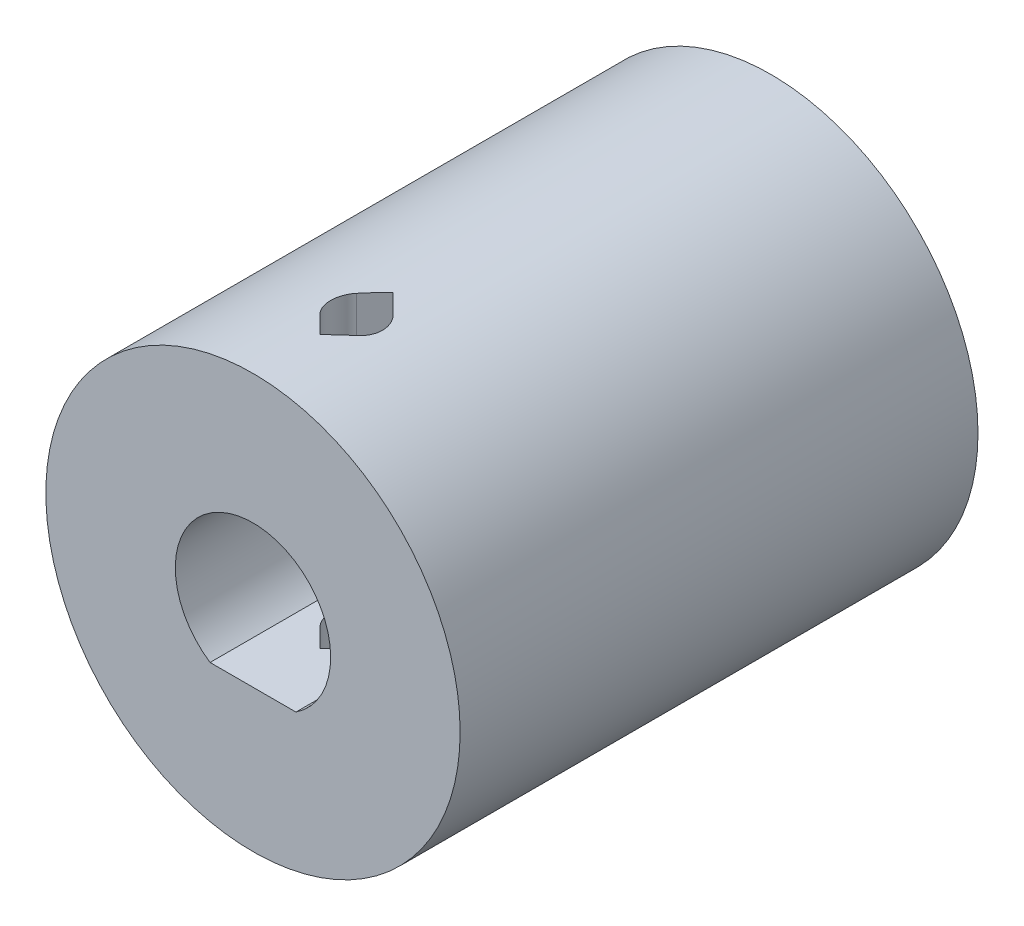
ISO-10303-21;
HEADER;
FILE_DESCRIPTION(('STEP AP214'),'2;1');
FILE_NAME('part.step','',(''),(''),'','','');
FILE_SCHEMA(('AUTOMOTIVE_DESIGN { 1 0 10303 214 1 1 1 1 }'));
ENDSEC;
DATA;
#1=APPLICATION_CONTEXT('core data for automotive mechanical design processes');
#2=APPLICATION_PROTOCOL_DEFINITION('international standard','automotive_design',2000,#1);
#3=PRODUCT_CONTEXT('',#1,'mechanical');
#4=PRODUCT('Part','Part','',(#3));
#5=PRODUCT_RELATED_PRODUCT_CATEGORY('part','',(#4));
#6=PRODUCT_DEFINITION_FORMATION('','',#4);
#7=PRODUCT_DEFINITION_CONTEXT('part definition',#1,'design');
#8=PRODUCT_DEFINITION('design','',#6,#7);
#9=PRODUCT_DEFINITION_SHAPE('','',#8);
#10=(LENGTH_UNIT() NAMED_UNIT(*) SI_UNIT(.MILLI.,.METRE.));
#11=(NAMED_UNIT(*) PLANE_ANGLE_UNIT() SI_UNIT($,.RADIAN.));
#12=(NAMED_UNIT(*) SI_UNIT($,.STERADIAN.) SOLID_ANGLE_UNIT());
#13=UNCERTAINTY_MEASURE_WITH_UNIT(LENGTH_MEASURE(1.E-05),#10,'distance_accuracy_value','');
#14=(GEOMETRIC_REPRESENTATION_CONTEXT(3) GLOBAL_UNCERTAINTY_ASSIGNED_CONTEXT((#13)) GLOBAL_UNIT_ASSIGNED_CONTEXT((#10,
#11,#12)) REPRESENTATION_CONTEXT('',''));
#15=CARTESIAN_POINT('',(0.,0.,0.));
#16=DIRECTION('',(0.,0.,1.));
#17=DIRECTION('',(1.,0.,0.));
#18=AXIS2_PLACEMENT_3D('',#15,#16,#17);
#19=CARTESIAN_POINT('',(0.,0.,12.));
#20=DIRECTION('',(0.,0.,-1.));
#21=DIRECTION('',(-1.,0.,0.));
#22=AXIS2_PLACEMENT_3D('',#19,#20,#21);
#23=CYLINDRICAL_SURFACE('',#22,3.);
#24=CARTESIAN_POINT('',(1.6583123951777,-2.5,4.));
#25=CARTESIAN_POINT('',(3.44675530662855,-1.31368118074935,4.));
#26=CARTESIAN_POINT('',(3.59463112171538,0.827349676510645,4.));
#27=CARTESIAN_POINT('',(1.98626444835849,2.24827790568407,4.));
#28=(BOUNDED_CURVE() B_SPLINE_CURVE(3,(#24,#25,#26,#27),.UNSPECIFIED.,.F.,
.F.) B_SPLINE_CURVE_WITH_KNOTS((4,4),(0.,1.),
.UNSPECIFIED.) CURVE() GEOMETRIC_REPRESENTATION_ITEM() RATIONAL_B_SPLINE_CURVE((1.,
0.739251046535707,0.739251046535707,1.)) REPRESENTATION_ITEM(''));
#29=CARTESIAN_POINT('',(1.6583123951777,-2.5,4.));
#30=VERTEX_POINT('',#29);
#31=CARTESIAN_POINT('',(1.98630617220221,2.24832536541855,4.));
#32=VERTEX_POINT('',#31);
#33=EDGE_CURVE('E408',#30,#32,#28,.T.);
#34=ORIENTED_EDGE('',*,*,#33,.F.);
#35=DIRECTION('',(0.,0.,-1.));
#36=VECTOR('',#35,1.);
#37=CARTESIAN_POINT('',(1.6583123951777,-2.5,12.));
#38=LINE('',#37,#36);
#39=CARTESIAN_POINT('',(1.6583123951777,-2.5,12.));
#40=VERTEX_POINT('',#39);
#41=EDGE_CURVE('E208',#40,#30,#38,.T.);
#42=ORIENTED_EDGE('',*,*,#41,.F.);
#43=CARTESIAN_POINT('',(0.,0.,12.));
#44=DIRECTION('',(0.,0.,1.));
#45=DIRECTION('',(1.,0.,0.));
#46=AXIS2_PLACEMENT_3D('',#43,#44,#45);
#47=CIRCLE('',#46,3.);
#48=CARTESIAN_POINT('',(-1.6583123951777,-2.5,12.));
#49=VERTEX_POINT('',#48);
#50=EDGE_CURVE('E488',#40,#49,#47,.T.);
#51=ORIENTED_EDGE('',*,*,#50,.T.);
#52=DIRECTION('',(0.,0.,-1.));
#53=VECTOR('',#52,1.);
#54=CARTESIAN_POINT('',(-1.6583123951777,-2.5,12.));
#55=LINE('',#54,#53);
#56=CARTESIAN_POINT('',(-1.6583123951777,-2.5,4.));
#57=VERTEX_POINT('',#56);
#58=EDGE_CURVE('E499',#49,#57,#55,.T.);
#59=ORIENTED_EDGE('',*,*,#58,.T.);
#60=CARTESIAN_POINT('',(0.,0.,4.));
#61=DIRECTION('',(0.,0.,1.));
#62=DIRECTION('',(1.,0.,0.));
#63=AXIS2_PLACEMENT_3D('',#60,#61,#62);
#64=CIRCLE('',#63,3.);
#65=CARTESIAN_POINT('',(-1.92299033897928,2.30270007034711,4.));
#66=VERTEX_POINT('',#65);
#67=EDGE_CURVE('E322',#66,#57,#64,.T.);
#68=ORIENTED_EDGE('',*,*,#67,.F.);
#69=EDGE_CURVE('E331',#32,#66,#64,.T.);
#70=ORIENTED_EDGE('',*,*,#69,.F.);
#71=EDGE_LOOP('',(#34,#42,#51,#59,#68,#70));
#72=FACE_BOUND('',#71,.T.);
#73=CARTESIAN_POINT('',(0.,0.,6.58578643762689));
#74=DIRECTION('',(-0.707106781186553,0.,0.707106781186542));
#75=DIRECTION('',(-0.707106781186542,0.,-0.707106781186553));
#76=AXIS2_PLACEMENT_3D('',#73,#74,#75);
#77=ELLIPSE('',#76,4.24264068711932,3.);
#78=CARTESIAN_POINT('',(0.707106781186554,2.91547594742265,7.29289321881346));
#79=VERTEX_POINT('',#78);
#80=CARTESIAN_POINT('',(0.,3.,6.58578643762689));
#81=VERTEX_POINT('',#80);
#82=EDGE_CURVE('E311',#79,#81,#77,.T.);
#83=ORIENTED_EDGE('',*,*,#82,.T.);
#84=CARTESIAN_POINT('',(0.,0.,6.5857864376269));
#85=DIRECTION('',(0.707106781186552,0.,0.707106781186543));
#86=DIRECTION('',(0.707106781186543,0.,-0.707106781186552));
#87=AXIS2_PLACEMENT_3D('',#84,#85,#86);
#88=ELLIPSE('',#87,4.24264068711931,3.);
#89=CARTESIAN_POINT('',(-0.707106781186552,2.91547594742265,7.29289321881346));
#90=VERTEX_POINT('',#89);
#91=EDGE_CURVE('E318',#81,#90,#88,.T.);
#92=ORIENTED_EDGE('',*,*,#91,.T.);
#93=CARTESIAN_POINT('',(-0.707106781186552,2.91547594742265,8.70710678118654));
#94=CARTESIAN_POINT('',(-0.746544495251623,2.90590689088709,8.66771282500314));
#95=CARTESIAN_POINT('',(-0.782650984488588,2.89630419139957,8.62497250703815));
#96=CARTESIAN_POINT('',(-0.84739581672067,2.87803104816888,8.53388355871564));
#97=CARTESIAN_POINT('',(-0.876021695283853,2.869362174342,8.48552575952272));
#98=CARTESIAN_POINT('',(-0.924901887136559,2.85398249976353,8.38434449860319));
#99=CARTESIAN_POINT('',(-0.945142898465573,2.84727481521217,8.33151410010419));
#100=CARTESIAN_POINT('',(-0.976453523603171,2.83669098170105,8.22298315194254));
#101=CARTESIAN_POINT('',(-0.987534040687127,2.83281146716512,8.16728609847596));
#102=CARTESIAN_POINT('',(-0.999875075659132,2.82847858521057,8.05678843526377));
#103=CARTESIAN_POINT('',(-1.00148599635301,2.82790298289868,8.00203170989229));
#104=CARTESIAN_POINT('',(-0.995759556065778,2.82992435750925,7.89303877469954));
#105=CARTESIAN_POINT('',(-0.988420881539864,2.83252180014412,7.83880264246412));
#106=CARTESIAN_POINT('',(-0.965388493758995,2.84045177633627,7.7338441284127));
#107=CARTESIAN_POINT('',(-0.949916168541015,2.84571170575801,7.68306711698607));
#108=CARTESIAN_POINT('',(-0.911263994011433,2.85832269312957,7.58480693577221));
#109=CARTESIAN_POINT('',(-0.888082869679271,2.86567409697617,7.53732431244172));
#110=CARTESIAN_POINT('',(-0.839936522019853,2.88010521973544,7.45567286200527));
#111=CARTESIAN_POINT('',(-0.81621511749034,2.88695491059857,7.42072038673531));
#112=CARTESIAN_POINT('',(-0.76465605735079,2.90103665229396,7.35418927976584));
#113=CARTESIAN_POINT('',(-0.736826301029517,2.90826795261612,7.32260436950714));
#114=CARTESIAN_POINT('',(-0.707106781186552,2.91547594742265,7.29289321881346));
#115=B_SPLINE_CURVE_WITH_KNOTS('',3,(#93,#94,#95,#96,#97,#98,#99,#100,#101,#102,#103,#104,#105,
#106,#107,#108,#109,#110,#111,#112,#113,#114),.UNSPECIFIED.,.F.,.F.,(4,2,2,2,2,2,2,2,2,2,4),(0.,
0.169509277672237,0.339299221728604,0.509357502633575,0.679213079114515,0.84274186120629,
1.00629464753866,1.16561011210774,1.32495194026529,1.45300990429925,1.58082477808484),.UNSPECIFIED.);
#116=CARTESIAN_POINT('',(-0.707106781186552,2.91547594742265,8.70710678118654));
#117=VERTEX_POINT('',#116);
#118=EDGE_CURVE('E275',#117,#90,#115,.T.);
#119=ORIENTED_EDGE('',*,*,#118,.F.);
#120=CARTESIAN_POINT('',(0.,0.,9.41421356237311));
#121=DIRECTION('',(-0.707106781186551,0.,0.707106781186544));
#122=DIRECTION('',(-0.707106781186544,0.,-0.707106781186551));
#123=AXIS2_PLACEMENT_3D('',#120,#121,#122);
#124=ELLIPSE('',#123,4.24264068711931,3.);
#125=CARTESIAN_POINT('',(0.,3.,9.41421356237311));
#126=VERTEX_POINT('',#125);
#127=EDGE_CURVE('E289',#126,#117,#124,.T.);
#128=ORIENTED_EDGE('',*,*,#127,.F.);
#129=CARTESIAN_POINT('',(0.,0.,9.41421356237311));
#130=DIRECTION('',(0.707106781186554,0.,0.707106781186541));
#131=DIRECTION('',(0.707106781186541,0.,-0.707106781186554));
#132=AXIS2_PLACEMENT_3D('',#129,#130,#131);
#133=ELLIPSE('',#132,4.24264068711932,3.);
#134=CARTESIAN_POINT('',(0.707106781186552,2.91547594742265,8.70710678118654));
#135=VERTEX_POINT('',#134);
#136=EDGE_CURVE('E216',#135,#126,#133,.T.);
#137=ORIENTED_EDGE('',*,*,#136,.F.);
#138=CARTESIAN_POINT('',(0.707106781186554,2.91547594742265,7.29289321881346));
#139=CARTESIAN_POINT('',(0.746544495251625,2.90590689088709,7.33228717499686));
#140=CARTESIAN_POINT('',(0.78265098448859,2.89630419139957,7.37502749296185));
#141=CARTESIAN_POINT('',(0.847395816720671,2.87803104816888,7.46611644128437));
#142=CARTESIAN_POINT('',(0.876021695283855,2.869362174342,7.51447424047728));
#143=CARTESIAN_POINT('',(0.924901887136561,2.85398249976353,7.61565550139681));
#144=CARTESIAN_POINT('',(0.945142898465575,2.84727481521217,7.66848589989581));
#145=CARTESIAN_POINT('',(0.976453523603172,2.83669098170105,7.77701684805747));
#146=CARTESIAN_POINT('',(0.987534040687127,2.83281146716512,7.83271390152404));
#147=CARTESIAN_POINT('',(0.999875075659132,2.82847858521057,7.94321156473623));
#148=CARTESIAN_POINT('',(1.00148599635301,2.82790298289868,7.99796829010772));
#149=CARTESIAN_POINT('',(0.995759556065778,2.82992435750925,8.10696122530047));
#150=CARTESIAN_POINT('',(0.988420881539864,2.83252180014412,8.16119735753588));
#151=CARTESIAN_POINT('',(0.965388493758994,2.84045177633627,8.26615587158731));
#152=CARTESIAN_POINT('',(0.949916168541015,2.84571170575801,8.31693288301394));
#153=CARTESIAN_POINT('',(0.911263994011432,2.85832269312957,8.41519306422779));
#154=CARTESIAN_POINT('',(0.88808286967927,2.86567409697617,8.46267568755828));
#155=CARTESIAN_POINT('',(0.839936522019851,2.88010521973544,8.54432713799473));
#156=CARTESIAN_POINT('',(0.816215117490338,2.88695491059857,8.5792796132647));
#157=CARTESIAN_POINT('',(0.76465605735079,2.90103665229396,8.64581072023416));
#158=CARTESIAN_POINT('',(0.736826301029517,2.90826795261612,8.67739563049286));
#159=CARTESIAN_POINT('',(0.707106781186553,2.91547594742265,8.70710678118654));
#160=B_SPLINE_CURVE_WITH_KNOTS('',3,(#138,#139,#140,#141,#142,#143,#144,#145,#146,#147,#148,
#149,#150,#151,#152,#153,#154,#155,#156,#157,#158,#159),.UNSPECIFIED.,.F.,.F.,(4,2,2,2,2,2,2,2,
2,2,4),(0.,0.169509277672237,0.339299221728605,0.509357502633579,0.679213079114516,
0.842741861206291,1.00629464753866,1.16561011210774,1.32495194026529,1.45300990429925,
1.58082477808484),.UNSPECIFIED.);
#161=EDGE_CURVE('E301',#79,#135,#160,.T.);
#162=ORIENTED_EDGE('',*,*,#161,.F.);
#163=EDGE_LOOP('',(#83,#92,#119,#128,#137,#162));
#164=FACE_BOUND('',#163,.T.);
#165=ADVANCED_FACE('F57',(#72,#164),#23,.F.);
#166=CARTESIAN_POINT('',(0.,-2.5,12.));
#167=DIRECTION('',(0.,-1.,0.));
#168=DIRECTION('',(0.,0.,-1.));
#169=AXIS2_PLACEMENT_3D('',#166,#167,#168);
#170=PLANE('',#169);
#171=CARTESIAN_POINT('',(1.6583123951777,-2.5,4.));
#172=DIRECTION('',(-1.,0.,0.));
#173=VECTOR('',#172,1.);
#174=LINE('',#171,#173);
#175=EDGE_CURVE('E414',#30,#57,#174,.T.);
#176=ORIENTED_EDGE('',*,*,#175,.T.);
#177=ORIENTED_EDGE('',*,*,#58,.F.);
#178=DIRECTION('',(-1.,0.,0.));
#179=VECTOR('',#178,1.);
#180=CARTESIAN_POINT('',(0.,-2.5,12.));
#181=LINE('',#180,#179);
#182=EDGE_CURVE('E492',#40,#49,#181,.T.);
#183=ORIENTED_EDGE('',*,*,#182,.F.);
#184=ORIENTED_EDGE('',*,*,#41,.T.);
#185=EDGE_LOOP('',(#176,#177,#183,#184));
#186=FACE_BOUND('',#185,.T.);
#187=DIRECTION('',(-0.707106781186543,0.,0.707106781186552));
#188=VECTOR('',#187,1.);
#189=CARTESIAN_POINT('',(-2.70710678118655,-2.5,9.29289321881348));
#190=LINE('',#189,#188);
#191=CARTESIAN_POINT('',(0.,-2.5,6.58578643762689));
#192=VERTEX_POINT('',#191);
#193=CARTESIAN_POINT('',(-0.707106781186552,-2.5,7.29289321881346));
#194=VERTEX_POINT('',#193);
#195=EDGE_CURVE('E315',#192,#194,#190,.T.);
#196=ORIENTED_EDGE('',*,*,#195,.F.);
#197=DIRECTION('',(-0.707106781186542,0.,-0.707106781186553));
#198=VECTOR('',#197,1.);
#199=CARTESIAN_POINT('',(2.70710678118655,-2.5,9.29289321881349));
#200=LINE('',#199,#198);
#201=CARTESIAN_POINT('',(0.707106781186554,-2.5,7.29289321881346));
#202=VERTEX_POINT('',#201);
#203=EDGE_CURVE('E308',#202,#192,#200,.T.);
#204=ORIENTED_EDGE('',*,*,#203,.F.);
#205=CARTESIAN_POINT('',(0.,-2.5,8.));
#206=DIRECTION('',(0.,-1.,0.));
#207=DIRECTION('',(0.,0.,-1.));
#208=AXIS2_PLACEMENT_3D('',#205,#206,#207);
#209=CIRCLE('',#208,1.);
#210=CARTESIAN_POINT('',(0.707106781186552,-2.5,8.70710678118654));
#211=VERTEX_POINT('',#210);
#212=EDGE_CURVE('E298',#202,#211,#209,.T.);
#213=ORIENTED_EDGE('',*,*,#212,.T.);
#214=DIRECTION('',(-0.707106781186541,0.,0.707106781186554));
#215=VECTOR('',#214,1.);
#216=CARTESIAN_POINT('',(-1.29289321881345,-2.5,10.7071067811866));
#217=LINE('',#216,#215);
#218=CARTESIAN_POINT('',(0.,-2.5,9.41421356237311));
#219=VERTEX_POINT('',#218);
#220=EDGE_CURVE('E292',#211,#219,#217,.T.);
#221=ORIENTED_EDGE('',*,*,#220,.T.);
#222=DIRECTION('',(-0.707106781186544,0.,-0.707106781186551));
#223=VECTOR('',#222,1.);
#224=CARTESIAN_POINT('',(1.29289321881345,-2.5,10.7071067811866));
#225=LINE('',#224,#223);
#226=CARTESIAN_POINT('',(-0.707106781186552,-2.5,8.70710678118654));
#227=VERTEX_POINT('',#226);
#228=EDGE_CURVE('E283',#219,#227,#225,.T.);
#229=ORIENTED_EDGE('',*,*,#228,.T.);
#230=CARTESIAN_POINT('',(0.,-2.5,8.));
#231=DIRECTION('',(0.,-1.,0.));
#232=DIRECTION('',(0.,0.,-1.));
#233=AXIS2_PLACEMENT_3D('',#230,#231,#232);
#234=CIRCLE('',#233,1.);
#235=EDGE_CURVE('E284',#227,#194,#234,.T.);
#236=ORIENTED_EDGE('',*,*,#235,.T.);
#237=EDGE_LOOP('',(#196,#204,#213,#221,#229,#236));
#238=FACE_BOUND('',#237,.T.);
#239=ADVANCED_FACE('F612',(#186,#238),#170,.F.);
#240=CARTESIAN_POINT('',(0.,0.,12.));
#241=DIRECTION('',(0.,0.,-1.));
#242=DIRECTION('',(-1.,0.,0.));
#243=AXIS2_PLACEMENT_3D('',#240,#241,#242);
#244=CYLINDRICAL_SURFACE('',#243,8.);
#245=CARTESIAN_POINT('',(0.707106781186554,7.96868872525461,7.29289321881346));
#246=CARTESIAN_POINT('',(0.746862145229429,7.96515709103125,7.33258404753605));
#247=CARTESIAN_POINT('',(0.78320103730727,7.9616357489408,7.37567837300214));
#248=CARTESIAN_POINT('',(0.84816897546063,7.95497921352591,7.4673290143472));
#249=CARTESIAN_POINT('',(0.876801693794671,7.95184383666357,7.51588271295064));
#250=CARTESIAN_POINT('',(0.925535379750706,7.94631898401423,7.61717952544982));
#251=CARTESIAN_POINT('',(0.945630942848141,7.94392998097845,7.66992526815468));
#252=CARTESIAN_POINT('',(0.976680323267441,7.94017274452224,7.77806078491189));
#253=CARTESIAN_POINT('',(0.987636897127691,7.93880420331926,7.83344975637014));
#254=CARTESIAN_POINT('',(1.00005576818294,7.93724939522374,7.94501482202784));
#255=CARTESIAN_POINT('',(1.00156575259578,7.93705719018941,8.00118552575233));
#256=CARTESIAN_POINT('',(0.995172490311846,7.93786127855559,8.11299148245489));
#257=CARTESIAN_POINT('',(0.987267506616719,7.9388577912666,8.16862663471809));
#258=CARTESIAN_POINT('',(0.962320739006834,7.94192007649058,8.27758597681951));
#259=CARTESIAN_POINT('',(0.945307923520545,7.94398245817764,8.33091691741764));
#260=CARTESIAN_POINT('',(0.902655612468504,7.94894146479201,8.43395612614799));
#261=CARTESIAN_POINT('',(0.877020238355116,7.95183769105917,8.48366611125788));
#262=CARTESIAN_POINT('',(0.827459316259774,7.95711714874891,8.56279049727067));
#263=CARTESIAN_POINT('',(0.805661832925506,7.95936338433339,8.59356953878151));
#264=CARTESIAN_POINT('',(0.758781513515916,7.96396908930962,8.65243086781842));
#265=CARTESIAN_POINT('',(0.733703565151139,7.96632838699519,8.68051706173002));
#266=CARTESIAN_POINT('',(0.707106781186552,7.96868872525461,8.70710678118654));
#267=B_SPLINE_CURVE_WITH_KNOTS('',3,(#245,#246,#247,#248,#249,#250,#251,#252,#253,#254,#255,
#256,#257,#258,#259,#260,#261,#262,#263,#264,#265,#266),.UNSPECIFIED.,.F.,.F.,(4,2,2,2,2,2,2,2,
2,2,4),(0.,0.168648066890811,0.337215624269314,0.505889736441538,0.674512954038989,
0.842284255270953,1.01008651397606,1.17735820330587,1.34455005265491,1.45767339368495,
1.57063006717695),.UNSPECIFIED.);
#268=CARTESIAN_POINT('',(0.707106781186554,7.96868872525461,7.29289321881346));
#269=VERTEX_POINT('',#268);
#270=CARTESIAN_POINT('',(0.707106781186552,7.96868872525461,8.70710678118654));
#271=VERTEX_POINT('',#270);
#272=EDGE_CURVE('E225',#269,#271,#267,.T.);
#273=ORIENTED_EDGE('',*,*,#272,.T.);
#274=CARTESIAN_POINT('',(0.,0.,9.41421356237311));
#275=DIRECTION('',(0.707106781186554,0.,0.707106781186541));
#276=DIRECTION('',(0.707106781186541,0.,-0.707106781186554));
#277=AXIS2_PLACEMENT_3D('',#274,#275,#276);
#278=ELLIPSE('',#277,11.3137084989849,8.);
#279=CARTESIAN_POINT('',(0.,8.,9.41421356237311));
#280=VERTEX_POINT('',#279);
#281=EDGE_CURVE('E75',#271,#280,#278,.T.);
#282=ORIENTED_EDGE('',*,*,#281,.T.);
#283=CARTESIAN_POINT('',(0.,0.,9.41421356237311));
#284=DIRECTION('',(-0.707106781186551,0.,0.707106781186544));
#285=DIRECTION('',(-0.707106781186544,0.,-0.707106781186551));
#286=AXIS2_PLACEMENT_3D('',#283,#284,#285);
#287=ELLIPSE('',#286,11.3137084989848,8.);
#288=CARTESIAN_POINT('',(-0.707106781186552,7.96868872525461,8.70710678118654));
#289=VERTEX_POINT('',#288);
#290=EDGE_CURVE('E198',#280,#289,#287,.T.);
#291=ORIENTED_EDGE('',*,*,#290,.T.);
#292=CARTESIAN_POINT('',(-0.707106781186552,7.96868872525461,8.70710678118654));
#293=CARTESIAN_POINT('',(-0.746862145229427,7.96515709103125,8.66741595246395));
#294=CARTESIAN_POINT('',(-0.783201037307267,7.9616357489408,8.62432162699787));
#295=CARTESIAN_POINT('',(-0.848168975460628,7.95497921352591,8.5326709856528));
#296=CARTESIAN_POINT('',(-0.87680169379467,7.95184383666357,8.48411728704937));
#297=CARTESIAN_POINT('',(-0.925535379750705,7.94631898401423,8.38282047455019));
#298=CARTESIAN_POINT('',(-0.945630942848141,7.94392998097845,8.33007473184532));
#299=CARTESIAN_POINT('',(-0.976680323267441,7.94017274452224,8.22193921508811));
#300=CARTESIAN_POINT('',(-0.987636897127691,7.93880420331926,8.16655024362986));
#301=CARTESIAN_POINT('',(-1.00005576818294,7.93724939522374,8.05498517797216));
#302=CARTESIAN_POINT('',(-1.00156575259578,7.93705719018941,7.99881447424768));
#303=CARTESIAN_POINT('',(-0.995172490311846,7.93786127855559,7.88700851754511));
#304=CARTESIAN_POINT('',(-0.987267506616719,7.9388577912666,7.83137336528192));
#305=CARTESIAN_POINT('',(-0.962320739006834,7.94192007649058,7.72241402318049));
#306=CARTESIAN_POINT('',(-0.945307923520546,7.94398245817764,7.66908308258236));
#307=CARTESIAN_POINT('',(-0.902655612468505,7.94894146479201,7.56604387385201));
#308=CARTESIAN_POINT('',(-0.877020238355117,7.95183769105917,7.51633388874213));
#309=CARTESIAN_POINT('',(-0.827459316259776,7.95711714874891,7.43720950272933));
#310=CARTESIAN_POINT('',(-0.805661832925507,7.95936338433339,7.4064304612185));
#311=CARTESIAN_POINT('',(-0.758781513515917,7.96396908930962,7.34756913218158));
#312=CARTESIAN_POINT('',(-0.733703565151139,7.96632838699519,7.31948293826998));
#313=CARTESIAN_POINT('',(-0.707106781186552,7.96868872525461,7.29289321881346));
#314=B_SPLINE_CURVE_WITH_KNOTS('',3,(#292,#293,#294,#295,#296,#297,#298,#299,#300,#301,#302,
#303,#304,#305,#306,#307,#308,#309,#310,#311,#312,#313),.UNSPECIFIED.,.F.,.F.,(4,2,2,2,2,2,2,2,
2,2,4),(0.,0.16864806689081,0.337215624269314,0.505889736441541,0.67451295403899,
0.842284255270954,1.01008651397606,1.17735820330587,1.34455005265491,1.45767339368495,
1.57063006717696),.UNSPECIFIED.);
#315=CARTESIAN_POINT('',(-0.707106781186552,7.96868872525461,7.29289321881346));
#316=VERTEX_POINT('',#315);
#317=EDGE_CURVE('E260',#289,#316,#314,.T.);
#318=ORIENTED_EDGE('',*,*,#317,.T.);
#319=CARTESIAN_POINT('',(0.,0.,6.5857864376269));
#320=DIRECTION('',(0.707106781186552,0.,0.707106781186543));
#321=DIRECTION('',(0.707106781186543,0.,-0.707106781186552));
#322=AXIS2_PLACEMENT_3D('',#319,#320,#321);
#323=ELLIPSE('',#322,11.3137084989848,8.);
#324=CARTESIAN_POINT('',(0.,8.,6.58578643762689));
#325=VERTEX_POINT('',#324);
#326=EDGE_CURVE('E227',#325,#316,#323,.T.);
#327=ORIENTED_EDGE('',*,*,#326,.F.);
#328=CARTESIAN_POINT('',(0.,0.,6.58578643762689));
#329=DIRECTION('',(-0.707106781186553,0.,0.707106781186542));
#330=DIRECTION('',(-0.707106781186542,0.,-0.707106781186553));
#331=AXIS2_PLACEMENT_3D('',#328,#329,#330);
#332=ELLIPSE('',#331,11.3137084989849,8.);
#333=EDGE_CURVE('E207',#269,#325,#332,.T.);
#334=ORIENTED_EDGE('',*,*,#333,.F.);
#335=EDGE_LOOP('',(#273,#282,#291,#318,#327,#334));
#336=FACE_BOUND('',#335,.T.);
#337=CARTESIAN_POINT('',(0.,0.,12.));
#338=DIRECTION('',(0.,0.,1.));
#339=DIRECTION('',(1.,0.,0.));
#340=AXIS2_PLACEMENT_3D('',#337,#338,#339);
#341=CIRCLE('',#340,8.);
#342=CARTESIAN_POINT('',(8.,0.,12.));
#343=VERTEX_POINT('',#342);
#344=EDGE_CURVE('E495',#343,#343,#341,.T.);
#345=ORIENTED_EDGE('',*,*,#344,.F.);
#346=EDGE_LOOP('',(#345));
#347=FACE_BOUND('',#346,.T.);
#348=CARTESIAN_POINT('',(0.,0.,-8.));
#349=DIRECTION('',(0.,0.,1.));
#350=DIRECTION('',(1.,0.,0.));
#351=AXIS2_PLACEMENT_3D('',#348,#349,#350);
#352=CIRCLE('',#351,8.);
#353=CARTESIAN_POINT('',(8.,0.,-8.));
#354=VERTEX_POINT('',#353);
#355=EDGE_CURVE('E404',#354,#354,#352,.T.);
#356=ORIENTED_EDGE('',*,*,#355,.T.);
#357=EDGE_LOOP('',(#356));
#358=FACE_BOUND('',#357,.T.);
#359=CARTESIAN_POINT('',(-0.707106781186552,-7.96868872525461,8.70710678118654));
#360=VERTEX_POINT('',#359);
#361=CARTESIAN_POINT('',(0.,-8.,9.41421356237311));
#362=VERTEX_POINT('',#361);
#363=EDGE_CURVE('E210',#360,#362,#287,.T.);
#364=ORIENTED_EDGE('',*,*,#363,.T.);
#365=CARTESIAN_POINT('',(0.707106781186552,-7.96868872525461,8.70710678118654));
#366=VERTEX_POINT('',#365);
#367=EDGE_CURVE('E12',#362,#366,#278,.T.);
#368=ORIENTED_EDGE('',*,*,#367,.T.);
#369=CARTESIAN_POINT('',(0.707106781186553,-7.96868872525461,8.70710678118654));
#370=CARTESIAN_POINT('',(0.746862145229428,-7.96515709103125,8.66741595246395));
#371=CARTESIAN_POINT('',(0.783201037307269,-7.9616357489408,8.62432162699786));
#372=CARTESIAN_POINT('',(0.84816897546063,-7.95497921352591,8.5326709856528));
#373=CARTESIAN_POINT('',(0.876801693794671,-7.95184383666357,8.48411728704936));
#374=CARTESIAN_POINT('',(0.925535379750705,-7.94631898401423,8.38282047455018));
#375=CARTESIAN_POINT('',(0.94563094284814,-7.94392998097845,8.33007473184532));
#376=CARTESIAN_POINT('',(0.97668032326744,-7.94017274452225,8.22193921508812));
#377=CARTESIAN_POINT('',(0.98763689712769,-7.93880420331926,8.16655024362986));
#378=CARTESIAN_POINT('',(1.00005576818294,-7.93724939522374,8.05498517797216));
#379=CARTESIAN_POINT('',(1.00156575259578,-7.93705719018941,7.99881447424767));
#380=CARTESIAN_POINT('',(0.995172490311846,-7.93786127855559,7.88700851754511));
#381=CARTESIAN_POINT('',(0.987267506616719,-7.9388577912666,7.83137336528191));
#382=CARTESIAN_POINT('',(0.962320739006834,-7.94192007649058,7.72241402318049));
#383=CARTESIAN_POINT('',(0.945307923520546,-7.94398245817764,7.66908308258236));
#384=CARTESIAN_POINT('',(0.902655612468505,-7.94894146479201,7.56604387385201));
#385=CARTESIAN_POINT('',(0.877020238355117,-7.95183769105917,7.51633388874213));
#386=CARTESIAN_POINT('',(0.827459316259775,-7.95711714874891,7.43720950272933));
#387=CARTESIAN_POINT('',(0.805661832925507,-7.95936338433339,7.4064304612185));
#388=CARTESIAN_POINT('',(0.758781513515917,-7.96396908930962,7.34756913218158));
#389=CARTESIAN_POINT('',(0.73370356515114,-7.96632838699519,7.31948293826999));
#390=CARTESIAN_POINT('',(0.707106781186554,-7.96868872525461,7.29289321881346));
#391=B_SPLINE_CURVE_WITH_KNOTS('',3,(#369,#370,#371,#372,#373,#374,#375,#376,#377,#378,#379,
#380,#381,#382,#383,#384,#385,#386,#387,#388,#389,#390),.UNSPECIFIED.,.F.,.F.,(4,2,2,2,2,2,2,2,
2,2,4),(0.,0.168648066890811,0.337215624269313,0.505889736441535,0.674512954038988,
0.842284255270955,1.01008651397606,1.17735820330587,1.3445500526549,1.45767339368495,
1.57063006717695),.UNSPECIFIED.);
#392=CARTESIAN_POINT('',(0.707106781186554,-7.96868872525461,7.29289321881346));
#393=VERTEX_POINT('',#392);
#394=EDGE_CURVE('E61',#366,#393,#391,.T.);
#395=ORIENTED_EDGE('',*,*,#394,.T.);
#396=CARTESIAN_POINT('',(0.,-8.,6.58578643762689));
#397=VERTEX_POINT('',#396);
#398=EDGE_CURVE('E232',#397,#393,#332,.T.);
#399=ORIENTED_EDGE('',*,*,#398,.F.);
#400=CARTESIAN_POINT('',(-0.707106781186552,-7.96868872525461,7.29289321881346));
#401=VERTEX_POINT('',#400);
#402=EDGE_CURVE('E73',#401,#397,#323,.T.);
#403=ORIENTED_EDGE('',*,*,#402,.F.);
#404=CARTESIAN_POINT('',(-0.707106781186552,-7.96868872525461,7.29289321881346));
#405=CARTESIAN_POINT('',(-0.746862145229427,-7.96515709103125,7.33258404753605));
#406=CARTESIAN_POINT('',(-0.783201037307268,-7.9616357489408,7.37567837300213));
#407=CARTESIAN_POINT('',(-0.848168975460628,-7.95497921352591,7.4673290143472));
#408=CARTESIAN_POINT('',(-0.87680169379467,-7.95184383666357,7.51588271295064));
#409=CARTESIAN_POINT('',(-0.925535379750704,-7.94631898401423,7.61717952544981));
#410=CARTESIAN_POINT('',(-0.94563094284814,-7.94392998097845,7.66992526815468));
#411=CARTESIAN_POINT('',(-0.97668032326744,-7.94017274452225,7.77806078491188));
#412=CARTESIAN_POINT('',(-0.98763689712769,-7.93880420331926,7.83344975637014));
#413=CARTESIAN_POINT('',(-1.00005576818294,-7.93724939522374,7.94501482202784));
#414=CARTESIAN_POINT('',(-1.00156575259578,-7.93705719018941,8.00118552575232));
#415=CARTESIAN_POINT('',(-0.995172490311846,-7.93786127855559,8.11299148245489));
#416=CARTESIAN_POINT('',(-0.98726750661672,-7.9388577912666,8.16862663471808));
#417=CARTESIAN_POINT('',(-0.962320739006835,-7.94192007649058,8.27758597681951));
#418=CARTESIAN_POINT('',(-0.945307923520547,-7.94398245817764,8.33091691741764));
#419=CARTESIAN_POINT('',(-0.902655612468506,-7.94894146479201,8.43395612614799));
#420=CARTESIAN_POINT('',(-0.877020238355117,-7.95183769105917,8.48366611125787));
#421=CARTESIAN_POINT('',(-0.827459316259775,-7.95711714874891,8.56279049727067));
#422=CARTESIAN_POINT('',(-0.805661832925507,-7.95936338433339,8.59356953878151));
#423=CARTESIAN_POINT('',(-0.758781513515917,-7.96396908930962,8.65243086781842));
#424=CARTESIAN_POINT('',(-0.733703565151139,-7.96632838699519,8.68051706173002));
#425=CARTESIAN_POINT('',(-0.707106781186552,-7.96868872525461,8.70710678118654));
#426=B_SPLINE_CURVE_WITH_KNOTS('',3,(#404,#405,#406,#407,#408,#409,#410,#411,#412,#413,#414,
#415,#416,#417,#418,#419,#420,#421,#422,#423,#424,#425),.UNSPECIFIED.,.F.,.F.,(4,2,2,2,2,2,2,2,
2,2,4),(0.,0.168648066890811,0.337215624269313,0.505889736441537,0.674512954038988,
0.842284255270954,1.01008651397606,1.17735820330587,1.34455005265491,1.45767339368495,
1.57063006717695),.UNSPECIFIED.);
#427=EDGE_CURVE('E237',#401,#360,#426,.T.);
#428=ORIENTED_EDGE('',*,*,#427,.T.);
#429=EDGE_LOOP('',(#364,#368,#395,#399,#403,#428));
#430=FACE_BOUND('',#429,.T.);
#431=ADVANCED_FACE('F222',(#336,#347,#358,#430),#244,.T.);
#432=CARTESIAN_POINT('',(0.,0.,12.));
#433=DIRECTION('',(0.,0.,1.));
#434=DIRECTION('',(1.,0.,0.));
#435=AXIS2_PLACEMENT_3D('',#432,#433,#434);
#436=PLANE('',#435);
#437=ORIENTED_EDGE('',*,*,#50,.F.);
#438=ORIENTED_EDGE('',*,*,#182,.T.);
#439=EDGE_LOOP('',(#437,#438));
#440=FACE_BOUND('',#439,.T.);
#441=ORIENTED_EDGE('',*,*,#344,.T.);
#442=EDGE_LOOP('',(#441));
#443=FACE_BOUND('',#442,.T.);
#444=ADVANCED_FACE('F619',(#440,#443),#436,.T.);
#445=CARTESIAN_POINT('',(0.,0.,-8.));
#446=DIRECTION('',(0.,0.,1.));
#447=DIRECTION('',(1.,0.,0.));
#448=AXIS2_PLACEMENT_3D('',#445,#446,#447);
#449=CYLINDRICAL_SURFACE('',#448,4.125);
#450=CARTESIAN_POINT('',(2.9168154723945,2.91681547239452,0.));
#451=CARTESIAN_POINT('',(4.62544641718353,1.2081845276055,0.));
#452=CARTESIAN_POINT('',(4.62544641718353,-1.20818452760549,0.));
#453=CARTESIAN_POINT('',(2.9168154723945,-2.91681547239451,0.));
#454=(BOUNDED_CURVE() B_SPLINE_CURVE(3,(#450,#451,#452,#453),.UNSPECIFIED.,.F.,
.F.) B_SPLINE_CURVE_WITH_KNOTS((4,4),(0.,1.),
.UNSPECIFIED.) CURVE() GEOMETRIC_REPRESENTATION_ITEM() RATIONAL_B_SPLINE_CURVE((1.,
0.804737854124364,0.804737854124364,1.)) REPRESENTATION_ITEM(''));
#455=CARTESIAN_POINT('',(2.9168154723945,-2.91681547239451,0.));
#456=VERTEX_POINT('',#455);
#457=CARTESIAN_POINT('',(2.9168154723945,2.91681547239452,0.));
#458=VERTEX_POINT('',#457);
#459=EDGE_CURVE('E586',#456,#458,#454,.F.);
#460=ORIENTED_EDGE('',*,*,#459,.T.);
#461=DIRECTION('',(0.,0.,1.));
#462=VECTOR('',#461,1.);
#463=CARTESIAN_POINT('',(2.9168154723945,2.91681547239452,-8.));
#464=LINE('',#463,#462);
#465=CARTESIAN_POINT('',(2.9168154723945,2.91681547239452,-8.));
#466=VERTEX_POINT('',#465);
#467=EDGE_CURVE('E406',#466,#458,#464,.T.);
#468=ORIENTED_EDGE('',*,*,#467,.F.);
#469=CARTESIAN_POINT('',(0.,0.,-8.));
#470=DIRECTION('',(0.,0.,1.));
#471=DIRECTION('',(1.,0.,0.));
#472=AXIS2_PLACEMENT_3D('',#469,#470,#471);
#473=CIRCLE('',#472,4.125);
#474=CARTESIAN_POINT('',(2.9168154723945,-2.91681547239451,-8.));
#475=VERTEX_POINT('',#474);
#476=EDGE_CURVE('E470',#475,#466,#473,.T.);
#477=ORIENTED_EDGE('',*,*,#476,.F.);
#478=DIRECTION('',(0.,0.,1.));
#479=VECTOR('',#478,1.);
#480=CARTESIAN_POINT('',(2.9168154723945,-2.91681547239451,-8.));
#481=LINE('',#480,#479);
#482=EDGE_CURVE('E400',#475,#456,#481,.T.);
#483=ORIENTED_EDGE('',*,*,#482,.T.);
#484=EDGE_LOOP('',(#460,#468,#477,#483));
#485=FACE_BOUND('',#484,.T.);
#486=ADVANCED_FACE('F543',(#485),#449,.F.);
#487=CARTESIAN_POINT('',(0.,2.91681547239452,-8.));
#488=DIRECTION('',(0.,-1.,0.));
#489=DIRECTION('',(0.,0.,-1.));
#490=AXIS2_PLACEMENT_3D('',#487,#488,#489);
#491=PLANE('',#490);
#492=CARTESIAN_POINT('',(-2.9168154723945,2.91681547239452,0.));
#493=CARTESIAN_POINT('',(-2.43067956032875,2.91681547239452,0.));
#494=CARTESIAN_POINT('',(-1.944543648263,2.91681547239452,0.));
#495=CARTESIAN_POINT('',(-0.972271824131502,2.91681547239452,0.));
#496=CARTESIAN_POINT('',(-0.486135912065752,2.91681547239452,0.));
#497=CARTESIAN_POINT('',(0.48613591206575,2.91681547239452,0.));
#498=CARTESIAN_POINT('',(0.9722718241315,2.91681547239452,0.));
#499=CARTESIAN_POINT('',(1.944543648263,2.91681547239452,0.));
#500=CARTESIAN_POINT('',(2.43067956032875,2.91681547239452,0.));
#501=CARTESIAN_POINT('',(2.9168154723945,2.91681547239452,0.));
#502=B_SPLINE_CURVE_WITH_KNOTS('',3,(#492,#493,#494,#495,#496,#497,#498,#499,#500,#501),
.UNSPECIFIED.,.F.,.F.,(4,2,2,2,4),(0.,0.25,0.5,0.75,1.),.UNSPECIFIED.);
#503=CARTESIAN_POINT('',(-2.9168154723945,2.91681547239452,0.));
#504=VERTEX_POINT('',#503);
#505=EDGE_CURVE('E478',#504,#458,#502,.T.);
#506=ORIENTED_EDGE('',*,*,#505,.F.);
#507=DIRECTION('',(0.,0.,1.));
#508=VECTOR('',#507,1.);
#509=CARTESIAN_POINT('',(-2.9168154723945,2.91681547239452,-8.));
#510=LINE('',#509,#508);
#511=CARTESIAN_POINT('',(-2.9168154723945,2.91681547239452,-8.));
#512=VERTEX_POINT('',#511);
#513=EDGE_CURVE('E399',#512,#504,#510,.T.);
#514=ORIENTED_EDGE('',*,*,#513,.F.);
#515=DIRECTION('',(1.,0.,0.));
#516=VECTOR('',#515,1.);
#517=CARTESIAN_POINT('',(0.,2.91681547239452,-8.));
#518=LINE('',#517,#516);
#519=EDGE_CURVE('E483',#512,#466,#518,.T.);
#520=ORIENTED_EDGE('',*,*,#519,.T.);
#521=ORIENTED_EDGE('',*,*,#467,.T.);
#522=EDGE_LOOP('',(#506,#514,#520,#521));
#523=FACE_BOUND('',#522,.T.);
#524=ADVANCED_FACE('F532',(#523),#491,.T.);
#525=CARTESIAN_POINT('',(-2.9168154723945,-2.91681547239451,0.));
#526=CARTESIAN_POINT('',(-4.62544641718353,-1.20818452760549,0.));
#527=CARTESIAN_POINT('',(-4.62544641718353,1.2081845276055,0.));
#528=CARTESIAN_POINT('',(-2.9168154723945,2.91681547239452,0.));
#529=(BOUNDED_CURVE() B_SPLINE_CURVE(3,(#525,#526,#527,#528),.UNSPECIFIED.,.F.,
.F.) B_SPLINE_CURVE_WITH_KNOTS((4,4),(0.,1.),
.UNSPECIFIED.) CURVE() GEOMETRIC_REPRESENTATION_ITEM() RATIONAL_B_SPLINE_CURVE((1.,
0.804737854124364,0.804737854124364,1.)) REPRESENTATION_ITEM(''));
#530=CARTESIAN_POINT('',(-2.9168154723945,-2.91681547239451,0.));
#531=VERTEX_POINT('',#530);
#532=EDGE_CURVE('E567',#504,#531,#529,.F.);
#533=ORIENTED_EDGE('',*,*,#532,.T.);
#534=DIRECTION('',(0.,0.,1.));
#535=VECTOR('',#534,1.);
#536=CARTESIAN_POINT('',(-2.9168154723945,-2.91681547239451,-8.));
#537=LINE('',#536,#535);
#538=CARTESIAN_POINT('',(-2.9168154723945,-2.91681547239451,-8.));
#539=VERTEX_POINT('',#538);
#540=EDGE_CURVE('E396',#539,#531,#537,.T.);
#541=ORIENTED_EDGE('',*,*,#540,.F.);
#542=EDGE_CURVE('E479',#512,#539,#473,.T.);
#543=ORIENTED_EDGE('',*,*,#542,.F.);
#544=ORIENTED_EDGE('',*,*,#513,.T.);
#545=EDGE_LOOP('',(#533,#541,#543,#544));
#546=FACE_BOUND('',#545,.T.);
#547=ADVANCED_FACE('F542',(#546),#449,.F.);
#548=CARTESIAN_POINT('',(0.,-2.91681547239451,-8.));
#549=DIRECTION('',(0.,1.,0.));
#550=DIRECTION('',(0.,0.,1.));
#551=AXIS2_PLACEMENT_3D('',#548,#549,#550);
#552=PLANE('',#551);
#553=CARTESIAN_POINT('',(2.9168154723945,-2.91681547239451,0.));
#554=DIRECTION('',(-1.,0.,0.));
#555=VECTOR('',#554,1.);
#556=LINE('',#553,#555);
#557=EDGE_CURVE('E581',#456,#531,#556,.T.);
#558=ORIENTED_EDGE('',*,*,#557,.F.);
#559=ORIENTED_EDGE('',*,*,#482,.F.);
#560=DIRECTION('',(-1.,0.,0.));
#561=VECTOR('',#560,1.);
#562=CARTESIAN_POINT('',(0.,-2.91681547239451,-8.));
#563=LINE('',#562,#561);
#564=EDGE_CURVE('E477',#475,#539,#563,.T.);
#565=ORIENTED_EDGE('',*,*,#564,.T.);
#566=ORIENTED_EDGE('',*,*,#540,.T.);
#567=EDGE_LOOP('',(#558,#559,#565,#566));
#568=FACE_BOUND('',#567,.T.);
#569=ADVANCED_FACE('F548',(#568),#552,.T.);
#570=CARTESIAN_POINT('',(0.,0.,-8.));
#571=DIRECTION('',(0.,0.,1.));
#572=DIRECTION('',(1.,0.,0.));
#573=AXIS2_PLACEMENT_3D('',#570,#571,#572);
#574=PLANE('',#573);
#575=ORIENTED_EDGE('',*,*,#476,.T.);
#576=ORIENTED_EDGE('',*,*,#519,.F.);
#577=ORIENTED_EDGE('',*,*,#542,.T.);
#578=ORIENTED_EDGE('',*,*,#564,.F.);
#579=EDGE_LOOP('',(#575,#576,#577,#578));
#580=FACE_BOUND('',#579,.T.);
#581=ORIENTED_EDGE('',*,*,#355,.F.);
#582=EDGE_LOOP('',(#581));
#583=FACE_BOUND('',#582,.T.);
#584=ADVANCED_FACE('F454',(#580,#583),#574,.F.);
#585=CARTESIAN_POINT('',(-1.6583123951777,-2.5,4.));
#586=CARTESIAN_POINT('',(-2.9168154723945,-2.91681547239451,0.));
#587=CARTESIAN_POINT('',(-3.48393971366875,-1.28901583550851,4.));
#588=CARTESIAN_POINT('',(-4.62544641718353,-1.20818452760549,0.));
#589=CARTESIAN_POINT('',(-3.60447526941571,0.898418490927549,4.));
#590=CARTESIAN_POINT('',(-4.62544641718353,1.2081845276055,0.));
#591=CARTESIAN_POINT('',(-1.92295631118378,2.3026591205123,4.));
#592=CARTESIAN_POINT('',(-2.9168154723945,2.91681547239452,0.));
#593=(BOUNDED_SURFACE() B_SPLINE_SURFACE(3,1,((#585,#586),(#587,#588),(#589,#590),(#591,#592)),
.UNSPECIFIED.,.F.,.F.,.F.) B_SPLINE_SURFACE_WITH_KNOTS((4,4),(2,2),(0.,1.),(0.,1.),
.UNSPECIFIED.) GEOMETRIC_REPRESENTATION_ITEM() RATIONAL_B_SPLINE_SURFACE(((1.,1.),
(0.731855742664693,0.804737854124364),(0.731855742664693,0.804737854124364),(1.,1.))) REPRESENTATION_ITEM('') SURFACE());
#594=DIRECTION('',(0.298650037519537,0.0989127152113434,0.9492230664386));
#595=VECTOR('',#594,1.);
#596=CARTESIAN_POINT('',(-2.2875639337861,-2.70840773619726,2.));
#597=LINE('',#596,#595);
#598=EDGE_CURVE('E335',#531,#57,#597,.T.);
#599=DIRECTION('',(-0.238499872419745,0.14738125610398,-0.959894044259562));
#600=VECTOR('',#599,1.);
#601=CARTESIAN_POINT('',(-2.41988589178914,2.60973729645341,2.));
#602=LINE('',#601,#600);
#603=EDGE_CURVE('E416',#66,#504,#602,.T.);
#604=ORIENTED_EDGE('',*,*,#67,.T.);
#605=ORIENTED_EDGE('',*,*,#598,.F.);
#606=ORIENTED_EDGE('',*,*,#532,.F.);
#607=ORIENTED_EDGE('',*,*,#603,.F.);
#608=EDGE_LOOP('',(#604,#605,#606,#607));
#609=FACE_BOUND('',#608,.T.);
#610=ADVANCED_FACE('F441',(#609),#593,.F.);
#611=CARTESIAN_POINT('',(-1.92295631118378,2.3026591205123,4.));
#612=CARTESIAN_POINT('',(-2.9168154723945,2.91681547239452,0.));
#613=CARTESIAN_POINT('',(-1.67288759529236,2.5114921219624,4.));
#614=CARTESIAN_POINT('',(-2.43067956032875,2.91681547239452,0.));
#615=CARTESIAN_POINT('',(-1.37185001033666,2.69190623435599,4.));
#616=CARTESIAN_POINT('',(-1.944543648263,2.91681547239452,0.));
#617=CARTESIAN_POINT('',(-0.699427232093589,2.93924023727752,4.));
#618=CARTESIAN_POINT('',(-0.972271824131502,2.91681547239452,0.));
#619=CARTESIAN_POINT('',(-0.328764885631519,3.00486371241362,4.));
#620=CARTESIAN_POINT('',(-0.486135912065752,2.91681547239452,0.));
#621=CARTESIAN_POINT('',(0.412222879608885,2.99455582311157,4.));
#622=CARTESIAN_POINT('',(0.48613591206575,2.91681547239452,0.));
#623=CARTESIAN_POINT('',(0.780916370878354,2.91864716043573,4.));
#624=CARTESIAN_POINT('',(0.9722718241315,2.91681547239452,0.));
#625=CARTESIAN_POINT('',(1.44619894910685,2.65270432295564,4.));
#626=CARTESIAN_POINT('',(1.944543648263,2.91681547239452,0.));
#627=CARTESIAN_POINT('',(1.74210153087187,2.46398616905537,4.));
#628=CARTESIAN_POINT('',(2.43067956032875,2.91681547239452,0.));
#629=CARTESIAN_POINT('',(1.98626444835849,2.24827790568407,4.));
#630=CARTESIAN_POINT('',(2.9168154723945,2.91681547239452,0.));
#631=B_SPLINE_SURFACE_WITH_KNOTS('',3,1,((#611,#612),(#613,#614),(#615,#616),(#617,#618),(#619,
#620),(#621,#622),(#623,#624),(#625,#626),(#627,#628),(#629,#630)),.UNSPECIFIED.,.F.,.F.,.F.,(4,
2,2,2,4),(2,2),(0.,0.25,0.5,0.75,1.),(0.,1.),.UNSPECIFIED.);
#632=DIRECTION('',(0.223643194167864,0.160672411268604,-0.961336620523492));
#633=VECTOR('',#632,1.);
#634=CARTESIAN_POINT('',(2.4515399603765,2.58254668903929,2.));
#635=LINE('',#634,#633);
#636=EDGE_CURVE('E424',#32,#458,#635,.T.);
#637=ORIENTED_EDGE('',*,*,#69,.T.);
#638=ORIENTED_EDGE('',*,*,#603,.T.);
#639=ORIENTED_EDGE('',*,*,#505,.T.);
#640=ORIENTED_EDGE('',*,*,#636,.F.);
#641=EDGE_LOOP('',(#637,#638,#639,#640));
#642=FACE_BOUND('',#641,.T.);
#643=ADVANCED_FACE('F453',(#642),#631,.F.);
#644=CARTESIAN_POINT('',(0.,-2.88548360412955,0.30067855288547));
#645=DIRECTION('',(0.,0.994614595310005,-0.103642688098654));
#646=DIRECTION('',(0.,0.103642688098654,0.994614595310005));
#647=AXIS2_PLACEMENT_3D('',#644,#645,#646);
#648=PLANE('',#647);
#649=ORIENTED_EDGE('',*,*,#598,.T.);
#650=ORIENTED_EDGE('',*,*,#175,.F.);
#651=DIRECTION('',(0.298650037519537,-0.0989127152113435,-0.9492230664386));
#652=VECTOR('',#651,1.);
#653=CARTESIAN_POINT('',(2.2875639337861,-2.70840773619726,2.));
#654=LINE('',#653,#652);
#655=EDGE_CURVE('E591',#30,#456,#654,.T.);
#656=ORIENTED_EDGE('',*,*,#655,.T.);
#657=ORIENTED_EDGE('',*,*,#557,.T.);
#658=EDGE_LOOP('',(#649,#650,#656,#657));
#659=FACE_BOUND('',#658,.T.);
#660=ADVANCED_FACE('F607',(#659),#648,.T.);
#661=CARTESIAN_POINT('',(1.98626444835849,2.24827790568407,4.));
#662=CARTESIAN_POINT('',(2.9168154723945,2.91681547239452,0.));
#663=CARTESIAN_POINT('',(3.59463112171538,0.827349676510645,4.));
#664=CARTESIAN_POINT('',(4.62544641718353,1.2081845276055,0.));
#665=CARTESIAN_POINT('',(3.44675530662855,-1.31368118074935,4.));
#666=CARTESIAN_POINT('',(4.62544641718353,-1.20818452760549,0.));
#667=CARTESIAN_POINT('',(1.6583123951777,-2.5,4.));
#668=CARTESIAN_POINT('',(2.9168154723945,-2.91681547239451,0.));
#669=(BOUNDED_SURFACE() B_SPLINE_SURFACE(3,1,((#661,#662),(#663,#664),(#665,#666),(#667,#668)),
.UNSPECIFIED.,.F.,.F.,.F.) B_SPLINE_SURFACE_WITH_KNOTS((4,4),(2,2),(0.,1.),(0.,1.),
.UNSPECIFIED.) GEOMETRIC_REPRESENTATION_ITEM() RATIONAL_B_SPLINE_SURFACE(((1.,1.),
(0.739251046535707,0.804737854124364),(0.739251046535707,0.804737854124364),(1.,1.))) REPRESENTATION_ITEM('') SURFACE());
#670=ORIENTED_EDGE('',*,*,#33,.T.);
#671=ORIENTED_EDGE('',*,*,#636,.T.);
#672=ORIENTED_EDGE('',*,*,#459,.F.);
#673=ORIENTED_EDGE('',*,*,#655,.F.);
#674=EDGE_LOOP('',(#670,#671,#672,#673));
#675=FACE_BOUND('',#674,.T.);
#676=ADVANCED_FACE('F680',(#675),#669,.F.);
#677=CARTESIAN_POINT('',(0.,-8.,8.));
#678=DIRECTION('',(0.,1.,0.));
#679=DIRECTION('',(0.,0.,1.));
#680=AXIS2_PLACEMENT_3D('',#677,#678,#679);
#681=CYLINDRICAL_SURFACE('',#680,1.);
#682=DIRECTION('',(0.,1.,0.));
#683=VECTOR('',#682,1.);
#684=CARTESIAN_POINT('',(-0.707106781186552,-8.,8.70710678118654));
#685=LINE('',#684,#683);
#686=EDGE_CURVE('E219',#360,#227,#685,.T.);
#687=ORIENTED_EDGE('',*,*,#686,.F.);
#688=ORIENTED_EDGE('',*,*,#427,.F.);
#689=DIRECTION('',(0.,1.,0.));
#690=VECTOR('',#689,1.);
#691=CARTESIAN_POINT('',(-0.707106781186552,-8.,7.29289321881346));
#692=LINE('',#691,#690);
#693=EDGE_CURVE('E90',#401,#194,#692,.T.);
#694=ORIENTED_EDGE('',*,*,#693,.T.);
#695=ORIENTED_EDGE('',*,*,#235,.F.);
#696=EDGE_LOOP('',(#687,#688,#694,#695));
#697=FACE_BOUND('',#696,.T.);
#698=ADVANCED_FACE('F373',(#697),#681,.F.);
#699=CARTESIAN_POINT('',(-4.70710678118655,-8.,4.7071067811865));
#700=DIRECTION('',(-0.707106781186551,0.,0.707106781186544));
#701=DIRECTION('',(0.707106781186544,0.,0.707106781186551));
#702=AXIS2_PLACEMENT_3D('',#699,#700,#701);
#703=PLANE('',#702);
#704=DIRECTION('',(0.,1.,0.));
#705=VECTOR('',#704,1.);
#706=CARTESIAN_POINT('',(0.,-8.,9.41421356237311));
#707=LINE('',#706,#705);
#708=EDGE_CURVE('E218',#362,#219,#707,.T.);
#709=ORIENTED_EDGE('',*,*,#708,.F.);
#710=ORIENTED_EDGE('',*,*,#363,.F.);
#711=ORIENTED_EDGE('',*,*,#686,.T.);
#712=ORIENTED_EDGE('',*,*,#228,.F.);
#713=EDGE_LOOP('',(#709,#710,#711,#712));
#714=FACE_BOUND('',#713,.T.);
#715=ADVANCED_FACE('F380',(#714),#703,.F.);
#716=CARTESIAN_POINT('',(4.70710678118655,-8.,4.70710678118647));
#717=DIRECTION('',(0.707106781186554,0.,0.707106781186541));
#718=DIRECTION('',(0.707106781186541,0.,-0.707106781186554));
#719=AXIS2_PLACEMENT_3D('',#716,#717,#718);
#720=PLANE('',#719);
#721=DIRECTION('',(0.,1.,0.));
#722=VECTOR('',#721,1.);
#723=CARTESIAN_POINT('',(0.707106781186552,-8.,8.70710678118654));
#724=LINE('',#723,#722);
#725=EDGE_CURVE('E387',#366,#211,#724,.T.);
#726=ORIENTED_EDGE('',*,*,#725,.F.);
#727=ORIENTED_EDGE('',*,*,#367,.F.);
#728=ORIENTED_EDGE('',*,*,#708,.T.);
#729=ORIENTED_EDGE('',*,*,#220,.F.);
#730=EDGE_LOOP('',(#726,#727,#728,#729));
#731=FACE_BOUND('',#730,.T.);
#732=ADVANCED_FACE('F252',(#731),#720,.F.);
#733=DIRECTION('',(0.,1.,0.));
#734=VECTOR('',#733,1.);
#735=CARTESIAN_POINT('',(0.707106781186554,-8.,7.29289321881346));
#736=LINE('',#735,#734);
#737=EDGE_CURVE('E352',#393,#202,#736,.T.);
#738=ORIENTED_EDGE('',*,*,#737,.F.);
#739=ORIENTED_EDGE('',*,*,#394,.F.);
#740=ORIENTED_EDGE('',*,*,#725,.T.);
#741=ORIENTED_EDGE('',*,*,#212,.F.);
#742=EDGE_LOOP('',(#738,#739,#740,#741));
#743=FACE_BOUND('',#742,.T.);
#744=ADVANCED_FACE('F246',(#743),#681,.F.);
#745=CARTESIAN_POINT('',(-3.29289321881345,-8.,3.29289321881339));
#746=DIRECTION('',(-0.707106781186553,0.,0.707106781186542));
#747=DIRECTION('',(0.707106781186542,0.,0.707106781186553));
#748=AXIS2_PLACEMENT_3D('',#745,#746,#747);
#749=PLANE('',#748);
#750=ORIENTED_EDGE('',*,*,#203,.T.);
#751=DIRECTION('',(0.,1.,0.));
#752=VECTOR('',#751,1.);
#753=CARTESIAN_POINT('',(0.,-8.,6.58578643762689));
#754=LINE('',#753,#752);
#755=EDGE_CURVE('E355',#397,#192,#754,.T.);
#756=ORIENTED_EDGE('',*,*,#755,.F.);
#757=ORIENTED_EDGE('',*,*,#398,.T.);
#758=ORIENTED_EDGE('',*,*,#737,.T.);
#759=EDGE_LOOP('',(#750,#756,#757,#758));
#760=FACE_BOUND('',#759,.T.);
#761=ADVANCED_FACE('F251',(#760),#749,.T.);
#762=CARTESIAN_POINT('',(3.29289321881345,-8.,3.29289321881341));
#763=DIRECTION('',(0.707106781186552,0.,0.707106781186543));
#764=DIRECTION('',(0.707106781186543,0.,-0.707106781186552));
#765=AXIS2_PLACEMENT_3D('',#762,#763,#764);
#766=PLANE('',#765);
#767=ORIENTED_EDGE('',*,*,#195,.T.);
#768=ORIENTED_EDGE('',*,*,#693,.F.);
#769=ORIENTED_EDGE('',*,*,#402,.T.);
#770=ORIENTED_EDGE('',*,*,#755,.T.);
#771=EDGE_LOOP('',(#767,#768,#769,#770));
#772=FACE_BOUND('',#771,.T.);
#773=ADVANCED_FACE('F370',(#772),#766,.T.);
#774=EDGE_CURVE('E362',#81,#325,#754,.T.);
#775=ORIENTED_EDGE('',*,*,#774,.T.);
#776=ORIENTED_EDGE('',*,*,#326,.T.);
#777=EDGE_CURVE('E390',#90,#316,#692,.T.);
#778=ORIENTED_EDGE('',*,*,#777,.F.);
#779=ORIENTED_EDGE('',*,*,#91,.F.);
#780=EDGE_LOOP('',(#775,#776,#778,#779));
#781=FACE_BOUND('',#780,.T.);
#782=ADVANCED_FACE('F725',(#781),#766,.T.);
#783=EDGE_CURVE('E363',#79,#269,#736,.T.);
#784=ORIENTED_EDGE('',*,*,#783,.T.);
#785=ORIENTED_EDGE('',*,*,#333,.T.);
#786=ORIENTED_EDGE('',*,*,#774,.F.);
#787=ORIENTED_EDGE('',*,*,#82,.F.);
#788=EDGE_LOOP('',(#784,#785,#786,#787));
#789=FACE_BOUND('',#788,.T.);
#790=ADVANCED_FACE('F718',(#789),#749,.T.);
#791=ORIENTED_EDGE('',*,*,#161,.T.);
#792=EDGE_CURVE('E384',#135,#271,#724,.T.);
#793=ORIENTED_EDGE('',*,*,#792,.T.);
#794=ORIENTED_EDGE('',*,*,#272,.F.);
#795=ORIENTED_EDGE('',*,*,#783,.F.);
#796=EDGE_LOOP('',(#791,#793,#794,#795));
#797=FACE_BOUND('',#796,.T.);
#798=ADVANCED_FACE('F254',(#797),#681,.F.);
#799=ORIENTED_EDGE('',*,*,#136,.T.);
#800=EDGE_CURVE('E201',#126,#280,#707,.T.);
#801=ORIENTED_EDGE('',*,*,#800,.T.);
#802=ORIENTED_EDGE('',*,*,#281,.F.);
#803=ORIENTED_EDGE('',*,*,#792,.F.);
#804=EDGE_LOOP('',(#799,#801,#802,#803));
#805=FACE_BOUND('',#804,.T.);
#806=ADVANCED_FACE('F212',(#805),#720,.F.);
#807=ORIENTED_EDGE('',*,*,#127,.T.);
#808=EDGE_CURVE('E82',#117,#289,#685,.T.);
#809=ORIENTED_EDGE('',*,*,#808,.T.);
#810=ORIENTED_EDGE('',*,*,#290,.F.);
#811=ORIENTED_EDGE('',*,*,#800,.F.);
#812=EDGE_LOOP('',(#807,#809,#810,#811));
#813=FACE_BOUND('',#812,.T.);
#814=ADVANCED_FACE('F200',(#813),#703,.F.);
#815=ORIENTED_EDGE('',*,*,#118,.T.);
#816=ORIENTED_EDGE('',*,*,#777,.T.);
#817=ORIENTED_EDGE('',*,*,#317,.F.);
#818=ORIENTED_EDGE('',*,*,#808,.F.);
#819=EDGE_LOOP('',(#815,#816,#817,#818));
#820=FACE_BOUND('',#819,.T.);
#821=ADVANCED_FACE('F255',(#820),#681,.F.);
#822=CLOSED_SHELL('',(#165,#239,#431,#444,#486,#524,#547,#569,#584,#610,#643,#660,#676,#698,
#715,#732,#744,#761,#773,#782,#790,#798,#806,#814,#821));
#823=MANIFOLD_SOLID_BREP('B2',#822);
#824=ADVANCED_BREP_SHAPE_REPRESENTATION('',(#18,#823),#14);
#825=SHAPE_DEFINITION_REPRESENTATION(#9,#824);
ENDSEC;
END-ISO-10303-21;
